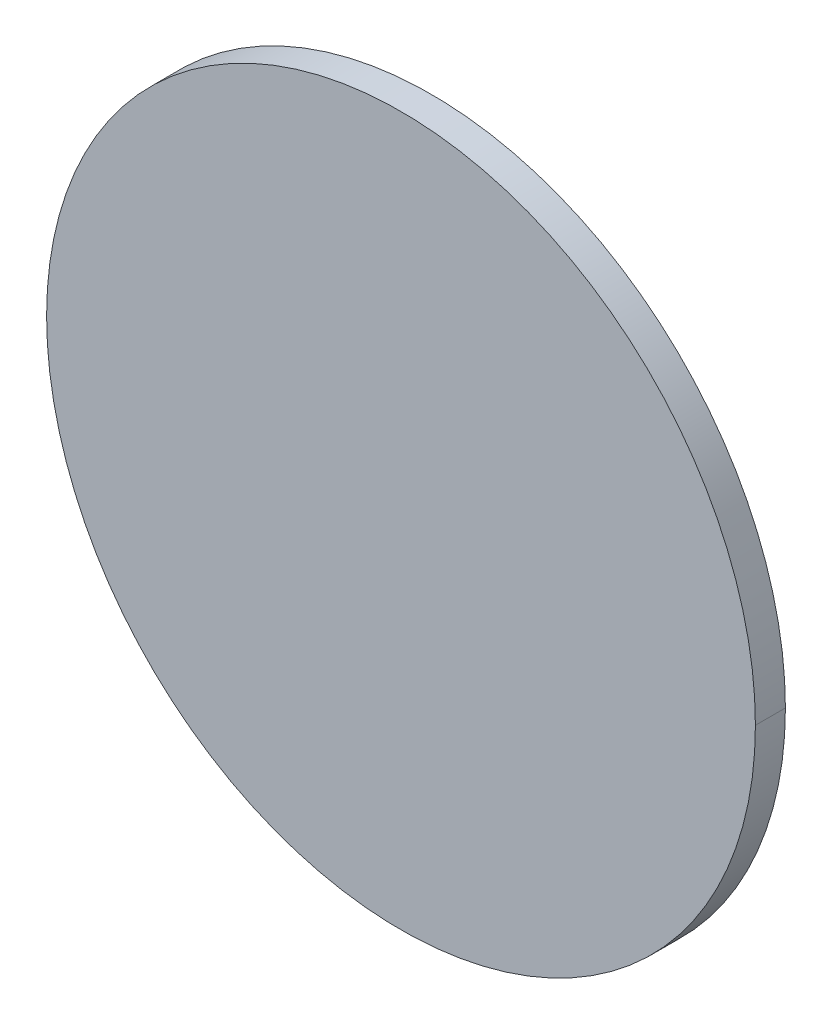
ISO-10303-21;
HEADER;
FILE_DESCRIPTION(('STEP AP214'),'2;1');
FILE_NAME('part.step','',(''),(''),'','','');
FILE_SCHEMA(('AUTOMOTIVE_DESIGN { 1 0 10303 214 1 1 1 1 }'));
ENDSEC;
DATA;
#1=APPLICATION_CONTEXT('core data for automotive mechanical design processes');
#2=APPLICATION_PROTOCOL_DEFINITION('international standard','automotive_design',2000,#1);
#3=PRODUCT_CONTEXT('',#1,'mechanical');
#4=PRODUCT('Part','Part','',(#3));
#5=PRODUCT_RELATED_PRODUCT_CATEGORY('part','',(#4));
#6=PRODUCT_DEFINITION_FORMATION('','',#4);
#7=PRODUCT_DEFINITION_CONTEXT('part definition',#1,'design');
#8=PRODUCT_DEFINITION('design','',#6,#7);
#9=PRODUCT_DEFINITION_SHAPE('','',#8);
#10=(LENGTH_UNIT() NAMED_UNIT(*) SI_UNIT(.MILLI.,.METRE.));
#11=(NAMED_UNIT(*) PLANE_ANGLE_UNIT() SI_UNIT($,.RADIAN.));
#12=(NAMED_UNIT(*) SI_UNIT($,.STERADIAN.) SOLID_ANGLE_UNIT());
#13=UNCERTAINTY_MEASURE_WITH_UNIT(LENGTH_MEASURE(1.E-05),#10,'distance_accuracy_value','');
#14=(GEOMETRIC_REPRESENTATION_CONTEXT(3) GLOBAL_UNCERTAINTY_ASSIGNED_CONTEXT((#13)) GLOBAL_UNIT_ASSIGNED_CONTEXT((#10,
#11,#12)) REPRESENTATION_CONTEXT('',''));
#15=CARTESIAN_POINT('',(0.,0.,0.));
#16=DIRECTION('',(0.,0.,1.));
#17=DIRECTION('',(1.,0.,0.));
#18=AXIS2_PLACEMENT_3D('',#15,#16,#17);
#19=CARTESIAN_POINT('',(52.457399902344,48.586996507645,1.1723000001));
#20=DIRECTION('',(0.,0.,1.));
#21=DIRECTION('',(1.,0.,0.));
#22=AXIS2_PLACEMENT_3D('',#19,#20,#21);
#23=PLANE('',#22);
#24=CARTESIAN_POINT('',(52.457399902344,48.586996507645,1.1723000001));
#25=DIRECTION('',(0.,0.,-1.));
#26=DIRECTION('',(1.,0.,0.));
#27=AXIS2_PLACEMENT_3D('',#24,#25,#26);
#28=CIRCLE('',#27,0.150000562688);
#29=CARTESIAN_POINT('',(52.607400465032,48.586996507645,1.1723000001));
#30=VERTEX_POINT('',#29);
#31=CARTESIAN_POINT('',(52.307399339656,48.586996507645,1.1723000001));
#32=VERTEX_POINT('',#31);
#33=EDGE_CURVE('E11',#30,#32,#28,.T.);
#34=ORIENTED_EDGE('',*,*,#33,.F.);
#35=CARTESIAN_POINT('',(52.457399902344,48.586996507645,1.1723000001));
#36=DIRECTION('',(0.,0.,-1.));
#37=DIRECTION('',(1.,0.,0.));
#38=AXIS2_PLACEMENT_3D('',#35,#36,#37);
#39=CIRCLE('',#38,0.150000562688);
#40=EDGE_CURVE('E21',#32,#30,#39,.T.);
#41=ORIENTED_EDGE('',*,*,#40,.F.);
#42=EDGE_LOOP('',(#34,#41));
#43=FACE_BOUND('',#42,.T.);
#44=ADVANCED_FACE('F17',(#43),#23,.T.);
#45=CARTESIAN_POINT('',(52.457399902344,48.586996507645,1.1596000001));
#46=DIRECTION('',(0.,0.,1.));
#47=DIRECTION('',(1.,0.,0.));
#48=AXIS2_PLACEMENT_3D('',#45,#46,#47);
#49=CYLINDRICAL_SURFACE('',#48,0.150000562688);
#50=DIRECTION('',(0.,0.,1.));
#51=VECTOR('',#50,1.);
#52=CARTESIAN_POINT('',(52.307399339656,48.586996507645,1.1596000001));
#53=LINE('',#52,#51);
#54=CARTESIAN_POINT('',(52.307399339656,48.586996507645,1.1596000001));
#55=VERTEX_POINT('',#54);
#56=EDGE_CURVE('E55',#55,#32,#53,.T.);
#57=ORIENTED_EDGE('',*,*,#56,.F.);
#58=CARTESIAN_POINT('',(52.457399902344,48.586996507645,1.1596000001));
#59=DIRECTION('',(0.,0.,1.));
#60=DIRECTION('',(1.,0.,0.));
#61=AXIS2_PLACEMENT_3D('',#58,#59,#60);
#62=CIRCLE('',#61,0.150000562688);
#63=CARTESIAN_POINT('',(52.607400465032,48.586996507645,1.1596000001));
#64=VERTEX_POINT('',#63);
#65=EDGE_CURVE('E28',#55,#64,#62,.T.);
#66=ORIENTED_EDGE('',*,*,#65,.T.);
#67=DIRECTION('',(0.,0.,1.));
#68=VECTOR('',#67,1.);
#69=CARTESIAN_POINT('',(52.607400465032,48.586996507645,1.1596000001));
#70=LINE('',#69,#68);
#71=EDGE_CURVE('E52',#64,#30,#70,.T.);
#72=ORIENTED_EDGE('',*,*,#71,.T.);
#73=ORIENTED_EDGE('',*,*,#33,.T.);
#74=EDGE_LOOP('',(#57,#66,#72,#73));
#75=FACE_BOUND('',#74,.T.);
#76=ADVANCED_FACE('F51',(#75),#49,.T.);
#77=CARTESIAN_POINT('',(52.457399902344,48.586996507645,1.1596000001));
#78=DIRECTION('',(0.,0.,1.));
#79=DIRECTION('',(1.,0.,0.));
#80=AXIS2_PLACEMENT_3D('',#77,#78,#79);
#81=PLANE('',#80);
#82=CARTESIAN_POINT('',(52.457399902344,48.586996507645,1.1596000001));
#83=DIRECTION('',(0.,0.,1.));
#84=DIRECTION('',(1.,0.,0.));
#85=AXIS2_PLACEMENT_3D('',#82,#83,#84);
#86=CIRCLE('',#85,0.150000562688);
#87=EDGE_CURVE('E61',#64,#55,#86,.T.);
#88=ORIENTED_EDGE('',*,*,#87,.F.);
#89=ORIENTED_EDGE('',*,*,#65,.F.);
#90=EDGE_LOOP('',(#88,#89));
#91=FACE_BOUND('',#90,.T.);
#92=ADVANCED_FACE('F64',(#91),#81,.F.);
#93=CARTESIAN_POINT('',(52.457399902344,48.586996507645,1.1596000001));
#94=DIRECTION('',(0.,0.,1.));
#95=DIRECTION('',(1.,0.,0.));
#96=AXIS2_PLACEMENT_3D('',#93,#94,#95);
#97=CYLINDRICAL_SURFACE('',#96,0.150000562688);
#98=ORIENTED_EDGE('',*,*,#87,.T.);
#99=ORIENTED_EDGE('',*,*,#56,.T.);
#100=ORIENTED_EDGE('',*,*,#40,.T.);
#101=ORIENTED_EDGE('',*,*,#71,.F.);
#102=EDGE_LOOP('',(#98,#99,#100,#101));
#103=FACE_BOUND('',#102,.T.);
#104=ADVANCED_FACE('F19',(#103),#97,.T.);
#105=CLOSED_SHELL('',(#44,#76,#92,#104));
#106=MANIFOLD_SOLID_BREP('B1',#105);
#107=ADVANCED_BREP_SHAPE_REPRESENTATION('',(#18,#106),#14);
#108=SHAPE_DEFINITION_REPRESENTATION(#9,#107);
ENDSEC;
END-ISO-10303-21;
